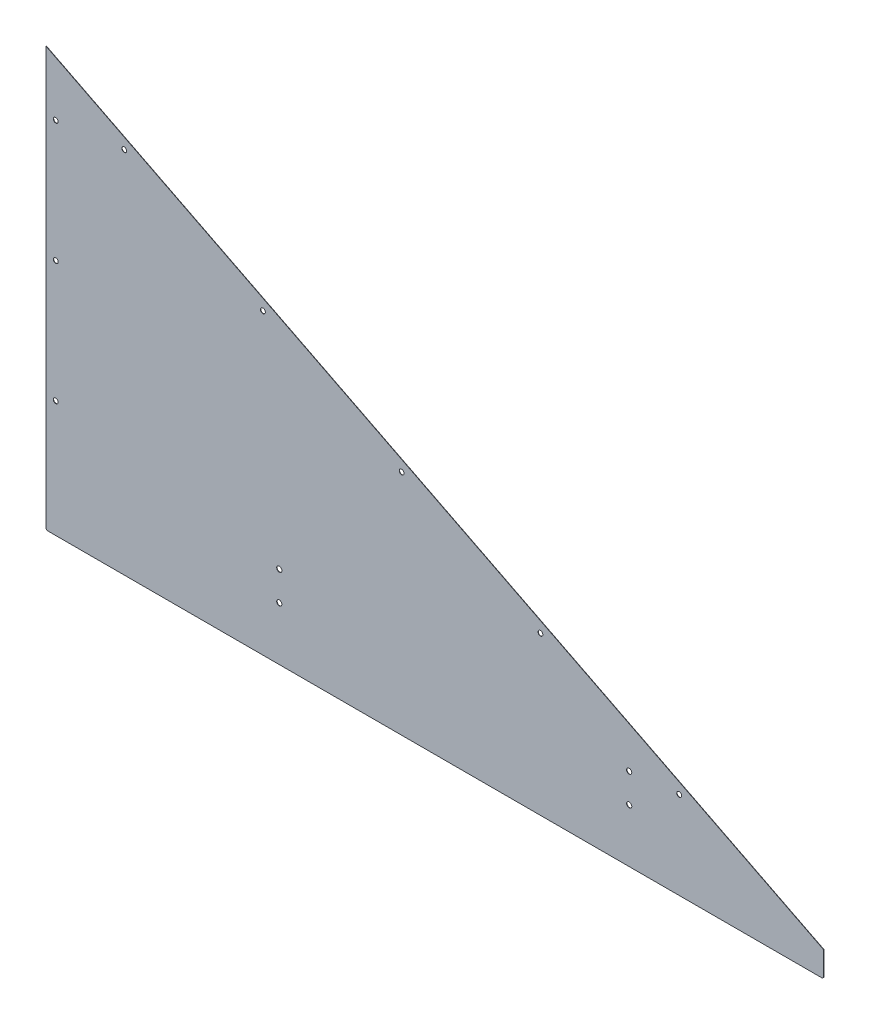
ISO-10303-21;
HEADER;
FILE_DESCRIPTION(('STEP AP214'),'2;1');
FILE_NAME('part.step','',(''),(''),'','','');
FILE_SCHEMA(('AUTOMOTIVE_DESIGN { 1 0 10303 214 1 1 1 1 }'));
ENDSEC;
DATA;
#1=APPLICATION_CONTEXT('core data for automotive mechanical design processes');
#2=APPLICATION_PROTOCOL_DEFINITION('international standard','automotive_design',2000,#1);
#3=PRODUCT_CONTEXT('',#1,'mechanical');
#4=PRODUCT('Part','Part','',(#3));
#5=PRODUCT_RELATED_PRODUCT_CATEGORY('part','',(#4));
#6=PRODUCT_DEFINITION_FORMATION('','',#4);
#7=PRODUCT_DEFINITION_CONTEXT('part definition',#1,'design');
#8=PRODUCT_DEFINITION('design','',#6,#7);
#9=PRODUCT_DEFINITION_SHAPE('','',#8);
#10=(LENGTH_UNIT() NAMED_UNIT(*) SI_UNIT(.MILLI.,.METRE.));
#11=(NAMED_UNIT(*) PLANE_ANGLE_UNIT() SI_UNIT($,.RADIAN.));
#12=(NAMED_UNIT(*) SI_UNIT($,.STERADIAN.) SOLID_ANGLE_UNIT());
#13=UNCERTAINTY_MEASURE_WITH_UNIT(LENGTH_MEASURE(1.E-05),#10,'distance_accuracy_value','');
#14=(GEOMETRIC_REPRESENTATION_CONTEXT(3) GLOBAL_UNCERTAINTY_ASSIGNED_CONTEXT((#13)) GLOBAL_UNIT_ASSIGNED_CONTEXT((#10,
#11,#12)) REPRESENTATION_CONTEXT('',''));
#15=CARTESIAN_POINT('',(0.,0.,0.));
#16=DIRECTION('',(0.,0.,1.));
#17=DIRECTION('',(1.,0.,0.));
#18=AXIS2_PLACEMENT_3D('',#15,#16,#17);
#19=CARTESIAN_POINT('',(-572.727030658364,255.302955948216,-54.7413659443409));
#20=DIRECTION('',(1.,0.,0.));
#21=DIRECTION('',(0.,0.,-1.));
#22=AXIS2_PLACEMENT_3D('',#19,#20,#21);
#23=PLANE('',#22);
#24=DIRECTION('',(0.,-1.,0.));
#25=VECTOR('',#24,1.);
#26=CARTESIAN_POINT('',(-572.727030658364,251.170139692126,-57.4083659443409));
#27=LINE('',#26,#25);
#28=CARTESIAN_POINT('',(-572.727030658364,237.509573097656,-57.4083659443409));
#29=VERTEX_POINT('',#28);
#30=CARTESIAN_POINT('',(-572.727030658364,-307.307044051784,-57.4083659443409));
#31=VERTEX_POINT('',#30);
#32=EDGE_CURVE('E113',#29,#31,#27,.T.);
#33=ORIENTED_EDGE('',*,*,#32,.F.);
#34=DIRECTION('',(0.,0.,-1.));
#35=VECTOR('',#34,1.);
#36=CARTESIAN_POINT('',(-572.727030658364,237.509573097656,-57.4083659443409));
#37=LINE('',#36,#35);
#38=CARTESIAN_POINT('',(-572.727030658364,237.509573097656,-57.9163659443409));
#39=VERTEX_POINT('',#38);
#40=EDGE_CURVE('E53',#29,#39,#37,.T.);
#41=ORIENTED_EDGE('',*,*,#40,.T.);
#42=DIRECTION('',(0.,-1.,0.));
#43=VECTOR('',#42,1.);
#44=CARTESIAN_POINT('',(-572.727030658364,255.302955948216,-57.9163659443409));
#45=LINE('',#44,#43);
#46=CARTESIAN_POINT('',(-572.727030658364,-307.307044051784,-57.9163659443409));
#47=VERTEX_POINT('',#46);
#48=EDGE_CURVE('E59',#39,#47,#45,.T.);
#49=ORIENTED_EDGE('',*,*,#48,.T.);
#50=DIRECTION('',(0.,0.,-1.));
#51=VECTOR('',#50,1.);
#52=CARTESIAN_POINT('',(-572.727030658364,-307.307044051784,-54.7413659443409));
#53=LINE('',#52,#51);
#54=EDGE_CURVE('E11',#47,#31,#53,.F.);
#55=ORIENTED_EDGE('',*,*,#54,.T.);
#56=EDGE_LOOP('',(#33,#41,#49,#55));
#57=FACE_BOUND('',#56,.T.);
#58=ADVANCED_FACE('F36',(#57),#23,.F.);
#59=CARTESIAN_POINT('',(-572.727030658364,-309.847044051784,-54.7413659443409));
#60=DIRECTION('',(0.,1.,0.));
#61=DIRECTION('',(0.,0.,1.));
#62=AXIS2_PLACEMENT_3D('',#59,#60,#61);
#63=PLANE('',#62);
#64=DIRECTION('',(1.,0.,0.));
#65=VECTOR('',#64,1.);
#66=CARTESIAN_POINT('',(-570.187030658364,-309.847044051784,-57.4083659443409));
#67=LINE('',#66,#65);
#68=CARTESIAN_POINT('',(-570.187030658364,-309.847044051784,-57.4083659443409));
#69=VERTEX_POINT('',#68);
#70=CARTESIAN_POINT('',(440.732969341636,-309.847044051784,-57.4083659443409));
#71=VERTEX_POINT('',#70);
#72=EDGE_CURVE('E126',#69,#71,#67,.T.);
#73=ORIENTED_EDGE('',*,*,#72,.F.);
#74=DIRECTION('',(0.,0.,-1.));
#75=VECTOR('',#74,1.);
#76=CARTESIAN_POINT('',(-570.187030658364,-309.847044051784,-54.7413659443409));
#77=LINE('',#76,#75);
#78=CARTESIAN_POINT('',(-570.187030658364,-309.847044051784,-57.9163659443409));
#79=VERTEX_POINT('',#78);
#80=EDGE_CURVE('E238',#69,#79,#77,.T.);
#81=ORIENTED_EDGE('',*,*,#80,.T.);
#82=DIRECTION('',(1.,0.,0.));
#83=VECTOR('',#82,1.);
#84=CARTESIAN_POINT('',(-572.727030658364,-309.847044051784,-57.9163659443409));
#85=LINE('',#84,#83);
#86=CARTESIAN_POINT('',(440.732969341636,-309.847044051784,-57.9163659443409));
#87=VERTEX_POINT('',#86);
#88=EDGE_CURVE('E223',#79,#87,#85,.T.);
#89=ORIENTED_EDGE('',*,*,#88,.T.);
#90=DIRECTION('',(0.,0.,-1.));
#91=VECTOR('',#90,1.);
#92=CARTESIAN_POINT('',(440.732969341636,-309.847044051784,-54.7413659443409));
#93=LINE('',#92,#91);
#94=EDGE_CURVE('E46',#87,#71,#93,.F.);
#95=ORIENTED_EDGE('',*,*,#94,.T.);
#96=EDGE_LOOP('',(#73,#81,#89,#95));
#97=FACE_BOUND('',#96,.T.);
#98=ADVANCED_FACE('F247',(#97),#63,.F.);
#99=CARTESIAN_POINT('',(443.272969341636,-309.847044051784,-54.7413659443409));
#100=DIRECTION('',(-1.,0.,0.));
#101=DIRECTION('',(0.,0.,1.));
#102=AXIS2_PLACEMENT_3D('',#99,#100,#101);
#103=PLANE('',#102);
#104=DIRECTION('',(0.,1.,0.));
#105=VECTOR('',#104,1.);
#106=CARTESIAN_POINT('',(443.272969341636,-309.847044051784,-57.9163659443409));
#107=LINE('',#106,#105);
#108=CARTESIAN_POINT('',(443.272969341636,-307.307044051784,-57.9163659443409));
#109=VERTEX_POINT('',#108);
#110=CARTESIAN_POINT('',(443.272969341636,-276.840426902344,-57.9163659443409));
#111=VERTEX_POINT('',#110);
#112=EDGE_CURVE('E105',#109,#111,#107,.T.);
#113=ORIENTED_EDGE('',*,*,#112,.T.);
#114=DIRECTION('',(0.,0.,-1.));
#115=VECTOR('',#114,1.);
#116=CARTESIAN_POINT('',(443.272969341636,-276.840426902344,-57.4083659443409));
#117=LINE('',#116,#115);
#118=CARTESIAN_POINT('',(443.272969341636,-276.840426902344,-57.4083659443409));
#119=VERTEX_POINT('',#118);
#120=EDGE_CURVE('E91',#119,#111,#117,.T.);
#121=ORIENTED_EDGE('',*,*,#120,.F.);
#122=DIRECTION('',(0.,1.,0.));
#123=VECTOR('',#122,1.);
#124=CARTESIAN_POINT('',(443.272969341636,-307.307044051784,-57.4083659443409));
#125=LINE('',#124,#123);
#126=CARTESIAN_POINT('',(443.272969341636,-307.307044051784,-57.4083659443409));
#127=VERTEX_POINT('',#126);
#128=EDGE_CURVE('E102',#127,#119,#125,.T.);
#129=ORIENTED_EDGE('',*,*,#128,.F.);
#130=DIRECTION('',(0.,0.,-1.));
#131=VECTOR('',#130,1.);
#132=CARTESIAN_POINT('',(443.272969341636,-307.307044051784,-54.7413659443409));
#133=LINE('',#132,#131);
#134=EDGE_CURVE('E235',#127,#109,#133,.T.);
#135=ORIENTED_EDGE('',*,*,#134,.T.);
#136=EDGE_LOOP('',(#113,#121,#129,#135));
#137=FACE_BOUND('',#136,.T.);
#138=ADVANCED_FACE('F101',(#137),#103,.F.);
#139=CARTESIAN_POINT('',(-560.027030658364,-157.447044051784,-54.7413659443409));
#140=DIRECTION('',(0.,0.,1.));
#141=DIRECTION('',(1.,0.,0.));
#142=AXIS2_PLACEMENT_3D('',#139,#140,#141);
#143=CYLINDRICAL_SURFACE('',#142,3.17499999999993);
#144=CARTESIAN_POINT('',(-560.027030658364,-157.447044051784,-57.9163659443409));
#145=DIRECTION('',(0.,0.,1.));
#146=DIRECTION('',(1.,0.,0.));
#147=AXIS2_PLACEMENT_3D('',#144,#145,#146);
#148=CIRCLE('',#147,3.17499999999993);
#149=CARTESIAN_POINT('',(-556.852030658364,-157.447044051784,-57.9163659443409));
#150=VERTEX_POINT('',#149);
#151=EDGE_CURVE('E217',#150,#150,#148,.T.);
#152=ORIENTED_EDGE('',*,*,#151,.F.);
#153=EDGE_LOOP('',(#152));
#154=FACE_BOUND('',#153,.T.);
#155=CARTESIAN_POINT('',(-560.027030658364,-157.447044051784,-57.4083659443409));
#156=DIRECTION('',(0.,0.,1.));
#157=DIRECTION('',(1.,0.,0.));
#158=AXIS2_PLACEMENT_3D('',#155,#156,#157);
#159=CIRCLE('',#158,3.17499999999993);
#160=CARTESIAN_POINT('',(-556.852030658364,-157.447044051784,-57.4083659443409));
#161=VERTEX_POINT('',#160);
#162=EDGE_CURVE('E169',#161,#161,#159,.F.);
#163=ORIENTED_EDGE('',*,*,#162,.F.);
#164=EDGE_LOOP('',(#163));
#165=FACE_BOUND('',#164,.T.);
#166=ADVANCED_FACE('F283',(#154,#165),#143,.F.);
#167=CARTESIAN_POINT('',(-560.027030658364,1.30295594821589,-54.7413659443409));
#168=DIRECTION('',(0.,0.,1.));
#169=DIRECTION('',(1.,0.,0.));
#170=AXIS2_PLACEMENT_3D('',#167,#168,#169);
#171=CYLINDRICAL_SURFACE('',#170,3.17499999999993);
#172=CARTESIAN_POINT('',(-560.027030658364,1.30295594821589,-57.9163659443409));
#173=DIRECTION('',(0.,0.,1.));
#174=DIRECTION('',(1.,0.,0.));
#175=AXIS2_PLACEMENT_3D('',#172,#173,#174);
#176=CIRCLE('',#175,3.17499999999993);
#177=CARTESIAN_POINT('',(-556.852030658364,1.30295594821589,-57.9163659443409));
#178=VERTEX_POINT('',#177);
#179=EDGE_CURVE('E213',#178,#178,#176,.T.);
#180=ORIENTED_EDGE('',*,*,#179,.F.);
#181=EDGE_LOOP('',(#180));
#182=FACE_BOUND('',#181,.T.);
#183=CARTESIAN_POINT('',(-560.027030658364,1.30295594821589,-57.4083659443409));
#184=DIRECTION('',(0.,0.,1.));
#185=DIRECTION('',(1.,0.,0.));
#186=AXIS2_PLACEMENT_3D('',#183,#184,#185);
#187=CIRCLE('',#186,3.17499999999993);
#188=CARTESIAN_POINT('',(-556.852030658364,1.30295594821589,-57.4083659443409));
#189=VERTEX_POINT('',#188);
#190=EDGE_CURVE('E165',#189,#189,#187,.F.);
#191=ORIENTED_EDGE('',*,*,#190,.F.);
#192=EDGE_LOOP('',(#191));
#193=FACE_BOUND('',#192,.T.);
#194=ADVANCED_FACE('F290',(#182,#193),#171,.F.);
#195=CARTESIAN_POINT('',(-560.027030658364,160.052955948216,-54.7413659443409));
#196=DIRECTION('',(0.,0.,1.));
#197=DIRECTION('',(1.,0.,0.));
#198=AXIS2_PLACEMENT_3D('',#195,#196,#197);
#199=CYLINDRICAL_SURFACE('',#198,3.17499999999993);
#200=CARTESIAN_POINT('',(-560.027030658364,160.052955948216,-57.9163659443409));
#201=DIRECTION('',(0.,0.,1.));
#202=DIRECTION('',(1.,0.,0.));
#203=AXIS2_PLACEMENT_3D('',#200,#201,#202);
#204=CIRCLE('',#203,3.17499999999993);
#205=CARTESIAN_POINT('',(-556.852030658364,160.052955948216,-57.9163659443409));
#206=VERTEX_POINT('',#205);
#207=EDGE_CURVE('E209',#206,#206,#204,.T.);
#208=ORIENTED_EDGE('',*,*,#207,.F.);
#209=EDGE_LOOP('',(#208));
#210=FACE_BOUND('',#209,.T.);
#211=CARTESIAN_POINT('',(-560.027030658364,160.052955948216,-57.4083659443409));
#212=DIRECTION('',(0.,0.,1.));
#213=DIRECTION('',(1.,0.,0.));
#214=AXIS2_PLACEMENT_3D('',#211,#212,#213);
#215=CIRCLE('',#214,3.17499999999993);
#216=CARTESIAN_POINT('',(-556.852030658364,160.052955948216,-57.4083659443409));
#217=VERTEX_POINT('',#216);
#218=EDGE_CURVE('E161',#217,#217,#215,.F.);
#219=ORIENTED_EDGE('',*,*,#218,.F.);
#220=EDGE_LOOP('',(#219));
#221=FACE_BOUND('',#220,.T.);
#222=ADVANCED_FACE('F294',(#210,#221),#199,.F.);
#223=CARTESIAN_POINT('',(189.272969341636,-201.897044051912,-54.7413659443409));
#224=DIRECTION('',(0.,0.,1.));
#225=DIRECTION('',(1.,0.,0.));
#226=AXIS2_PLACEMENT_3D('',#223,#224,#225);
#227=CYLINDRICAL_SURFACE('',#226,3.373501);
#228=CARTESIAN_POINT('',(189.272969341636,-201.897044051912,-57.9163659443409));
#229=DIRECTION('',(0.,0.,1.));
#230=DIRECTION('',(1.,0.,0.));
#231=AXIS2_PLACEMENT_3D('',#228,#229,#230);
#232=CIRCLE('',#231,3.373501);
#233=CARTESIAN_POINT('',(192.646470341636,-201.897044051912,-57.9163659443409));
#234=VERTEX_POINT('',#233);
#235=EDGE_CURVE('E205',#234,#234,#232,.T.);
#236=ORIENTED_EDGE('',*,*,#235,.F.);
#237=EDGE_LOOP('',(#236));
#238=FACE_BOUND('',#237,.T.);
#239=CARTESIAN_POINT('',(189.272969341636,-201.897044051912,-57.4083659443409));
#240=DIRECTION('',(0.,0.,1.));
#241=DIRECTION('',(1.,0.,0.));
#242=AXIS2_PLACEMENT_3D('',#239,#240,#241);
#243=CIRCLE('',#242,3.373501);
#244=CARTESIAN_POINT('',(192.646470341636,-201.897044051912,-57.4083659443409));
#245=VERTEX_POINT('',#244);
#246=EDGE_CURVE('E157',#245,#245,#243,.F.);
#247=ORIENTED_EDGE('',*,*,#246,.F.);
#248=EDGE_LOOP('',(#247));
#249=FACE_BOUND('',#248,.T.);
#250=ADVANCED_FACE('F298',(#238,#249),#227,.F.);
#251=CARTESIAN_POINT('',(-267.927030658364,-239.997044051912,-54.7413659443409));
#252=DIRECTION('',(0.,0.,1.));
#253=DIRECTION('',(1.,0.,0.));
#254=AXIS2_PLACEMENT_3D('',#251,#252,#253);
#255=CYLINDRICAL_SURFACE('',#254,3.373501);
#256=CARTESIAN_POINT('',(-267.927030658364,-239.997044051912,-57.9163659443409));
#257=DIRECTION('',(0.,0.,1.));
#258=DIRECTION('',(1.,0.,0.));
#259=AXIS2_PLACEMENT_3D('',#256,#257,#258);
#260=CIRCLE('',#259,3.373501);
#261=CARTESIAN_POINT('',(-264.553529658364,-239.997044051912,-57.9163659443409));
#262=VERTEX_POINT('',#261);
#263=EDGE_CURVE('E201',#262,#262,#260,.T.);
#264=ORIENTED_EDGE('',*,*,#263,.F.);
#265=EDGE_LOOP('',(#264));
#266=FACE_BOUND('',#265,.T.);
#267=CARTESIAN_POINT('',(-267.927030658364,-239.997044051912,-57.4083659443409));
#268=DIRECTION('',(0.,0.,1.));
#269=DIRECTION('',(1.,0.,0.));
#270=AXIS2_PLACEMENT_3D('',#267,#268,#269);
#271=CIRCLE('',#270,3.373501);
#272=CARTESIAN_POINT('',(-264.553529658364,-239.997044051912,-57.4083659443409));
#273=VERTEX_POINT('',#272);
#274=EDGE_CURVE('E153',#273,#273,#271,.F.);
#275=ORIENTED_EDGE('',*,*,#274,.F.);
#276=EDGE_LOOP('',(#275));
#277=FACE_BOUND('',#276,.T.);
#278=ADVANCED_FACE('F302',(#266,#277),#255,.F.);
#279=CARTESIAN_POINT('',(-267.927030658364,-201.897044051912,-54.7413659443409));
#280=DIRECTION('',(0.,0.,1.));
#281=DIRECTION('',(1.,0.,0.));
#282=AXIS2_PLACEMENT_3D('',#279,#280,#281);
#283=CYLINDRICAL_SURFACE('',#282,3.373501);
#284=CARTESIAN_POINT('',(-267.927030658364,-201.897044051912,-57.9163659443409));
#285=DIRECTION('',(0.,0.,1.));
#286=DIRECTION('',(1.,0.,0.));
#287=AXIS2_PLACEMENT_3D('',#284,#285,#286);
#288=CIRCLE('',#287,3.373501);
#289=CARTESIAN_POINT('',(-264.553529658364,-201.897044051912,-57.9163659443409));
#290=VERTEX_POINT('',#289);
#291=EDGE_CURVE('E197',#290,#290,#288,.T.);
#292=ORIENTED_EDGE('',*,*,#291,.F.);
#293=EDGE_LOOP('',(#292));
#294=FACE_BOUND('',#293,.T.);
#295=CARTESIAN_POINT('',(-267.927030658364,-201.897044051912,-57.4083659443409));
#296=DIRECTION('',(0.,0.,1.));
#297=DIRECTION('',(1.,0.,0.));
#298=AXIS2_PLACEMENT_3D('',#295,#296,#297);
#299=CIRCLE('',#298,3.373501);
#300=CARTESIAN_POINT('',(-264.553529658364,-201.897044051912,-57.4083659443409));
#301=VERTEX_POINT('',#300);
#302=EDGE_CURVE('E149',#301,#301,#299,.F.);
#303=ORIENTED_EDGE('',*,*,#302,.F.);
#304=EDGE_LOOP('',(#303));
#305=FACE_BOUND('',#304,.T.);
#306=ADVANCED_FACE('F306',(#294,#305),#283,.F.);
#307=CARTESIAN_POINT('',(189.272969341636,-239.997044051912,-54.7413659443409));
#308=DIRECTION('',(0.,0.,1.));
#309=DIRECTION('',(1.,0.,0.));
#310=AXIS2_PLACEMENT_3D('',#307,#308,#309);
#311=CYLINDRICAL_SURFACE('',#310,3.373501);
#312=CARTESIAN_POINT('',(189.272969341636,-239.997044051912,-57.9163659443409));
#313=DIRECTION('',(0.,0.,1.));
#314=DIRECTION('',(1.,0.,0.));
#315=AXIS2_PLACEMENT_3D('',#312,#313,#314);
#316=CIRCLE('',#315,3.373501);
#317=CARTESIAN_POINT('',(192.646470341636,-239.997044051912,-57.9163659443409));
#318=VERTEX_POINT('',#317);
#319=EDGE_CURVE('E193',#318,#318,#316,.T.);
#320=ORIENTED_EDGE('',*,*,#319,.F.);
#321=EDGE_LOOP('',(#320));
#322=FACE_BOUND('',#321,.T.);
#323=CARTESIAN_POINT('',(189.272969341636,-239.997044051912,-57.4083659443409));
#324=DIRECTION('',(0.,0.,1.));
#325=DIRECTION('',(1.,0.,0.));
#326=AXIS2_PLACEMENT_3D('',#323,#324,#325);
#327=CIRCLE('',#326,3.373501);
#328=CARTESIAN_POINT('',(192.646470341636,-239.997044051912,-57.4083659443409));
#329=VERTEX_POINT('',#328);
#330=EDGE_CURVE('E145',#329,#329,#327,.F.);
#331=ORIENTED_EDGE('',*,*,#330,.F.);
#332=EDGE_LOOP('',(#331));
#333=FACE_BOUND('',#332,.T.);
#334=ADVANCED_FACE('F273',(#322,#333),#311,.F.);
#335=CARTESIAN_POINT('',(440.732969341636,-307.307044051784,-54.7413659443409));
#336=DIRECTION('',(0.,0.,-1.));
#337=DIRECTION('',(-1.,0.,0.));
#338=AXIS2_PLACEMENT_3D('',#335,#336,#337);
#339=CYLINDRICAL_SURFACE('',#338,2.54);
#340=ORIENTED_EDGE('',*,*,#134,.F.);
#341=CARTESIAN_POINT('',(440.732969341636,-307.307044051784,-57.4083659443409));
#342=DIRECTION('',(0.,0.,1.));
#343=DIRECTION('',(1.,0.,0.));
#344=AXIS2_PLACEMENT_3D('',#341,#342,#343);
#345=CIRCLE('',#344,2.53999999999999);
#346=EDGE_CURVE('E111',#71,#127,#345,.T.);
#347=ORIENTED_EDGE('',*,*,#346,.F.);
#348=ORIENTED_EDGE('',*,*,#94,.F.);
#349=CARTESIAN_POINT('',(440.732969341636,-307.307044051784,-57.9163659443409));
#350=DIRECTION('',(0.,0.,1.));
#351=DIRECTION('',(1.,0.,0.));
#352=AXIS2_PLACEMENT_3D('',#349,#350,#351);
#353=CIRCLE('',#352,2.54);
#354=EDGE_CURVE('E232',#109,#87,#353,.F.);
#355=ORIENTED_EDGE('',*,*,#354,.F.);
#356=EDGE_LOOP('',(#340,#347,#348,#355));
#357=FACE_BOUND('',#356,.T.);
#358=ADVANCED_FACE('F252',(#357),#339,.T.);
#359=CARTESIAN_POINT('',(-570.187030658364,-307.307044051784,-54.7413659443409));
#360=DIRECTION('',(0.,0.,-1.));
#361=DIRECTION('',(-1.,0.,0.));
#362=AXIS2_PLACEMENT_3D('',#359,#360,#361);
#363=CYLINDRICAL_SURFACE('',#362,2.54);
#364=ORIENTED_EDGE('',*,*,#80,.F.);
#365=CARTESIAN_POINT('',(-570.187030658364,-307.307044051784,-57.4083659443409));
#366=DIRECTION('',(0.,0.,1.));
#367=DIRECTION('',(1.,0.,0.));
#368=AXIS2_PLACEMENT_3D('',#365,#366,#367);
#369=CIRCLE('',#368,2.53999999999999);
#370=EDGE_CURVE('E118',#31,#69,#369,.T.);
#371=ORIENTED_EDGE('',*,*,#370,.F.);
#372=ORIENTED_EDGE('',*,*,#54,.F.);
#373=CARTESIAN_POINT('',(-570.187030658364,-307.307044051784,-57.9163659443409));
#374=DIRECTION('',(0.,0.,1.));
#375=DIRECTION('',(1.,0.,0.));
#376=AXIS2_PLACEMENT_3D('',#373,#374,#375);
#377=CIRCLE('',#376,2.54);
#378=EDGE_CURVE('E229',#79,#47,#377,.F.);
#379=ORIENTED_EDGE('',*,*,#378,.F.);
#380=EDGE_LOOP('',(#364,#371,#372,#379));
#381=FACE_BOUND('',#380,.T.);
#382=ADVANCED_FACE('F38',(#381),#363,.T.);
#383=CARTESIAN_POINT('',(-108.008719548157,-11.9887781823342,-54.7413659443409));
#384=DIRECTION('',(0.,0.,1.));
#385=DIRECTION('',(1.,0.,0.));
#386=AXIS2_PLACEMENT_3D('',#383,#384,#385);
#387=CYLINDRICAL_SURFACE('',#386,3.17500000000004);
#388=CARTESIAN_POINT('',(-108.008719548157,-11.9887781823342,-57.9163659443409));
#389=DIRECTION('',(0.,0.,1.));
#390=DIRECTION('',(1.,0.,0.));
#391=AXIS2_PLACEMENT_3D('',#388,#389,#390);
#392=CIRCLE('',#391,3.17500000000004);
#393=CARTESIAN_POINT('',(-104.833719548157,-11.9887781823342,-57.9163659443409));
#394=VERTEX_POINT('',#393);
#395=EDGE_CURVE('E189',#394,#394,#392,.T.);
#396=ORIENTED_EDGE('',*,*,#395,.F.);
#397=EDGE_LOOP('',(#396));
#398=FACE_BOUND('',#397,.T.);
#399=CARTESIAN_POINT('',(-108.008719548157,-11.9887781823342,-57.4083659443409));
#400=DIRECTION('',(0.,0.,1.));
#401=DIRECTION('',(1.,0.,0.));
#402=AXIS2_PLACEMENT_3D('',#399,#400,#401);
#403=CIRCLE('',#402,3.17500000000004);
#404=CARTESIAN_POINT('',(-104.833719548157,-11.9887781823342,-57.4083659443409));
#405=VERTEX_POINT('',#404);
#406=EDGE_CURVE('E141',#405,#405,#403,.F.);
#407=ORIENTED_EDGE('',*,*,#406,.F.);
#408=EDGE_LOOP('',(#407));
#409=FACE_BOUND('',#408,.T.);
#410=ADVANCED_FACE('F265',(#398,#409),#387,.F.);
#411=CARTESIAN_POINT('',(73.2833948908056,-103.767911117059,-54.7413659443409));
#412=DIRECTION('',(0.,0.,1.));
#413=DIRECTION('',(1.,0.,0.));
#414=AXIS2_PLACEMENT_3D('',#411,#412,#413);
#415=CYLINDRICAL_SURFACE('',#414,3.17499999999998);
#416=CARTESIAN_POINT('',(73.2833948908056,-103.767911117059,-57.9163659443409));
#417=DIRECTION('',(0.,0.,1.));
#418=DIRECTION('',(1.,0.,0.));
#419=AXIS2_PLACEMENT_3D('',#416,#417,#418);
#420=CIRCLE('',#419,3.17499999999998);
#421=CARTESIAN_POINT('',(76.4583948908056,-103.767911117059,-57.9163659443409));
#422=VERTEX_POINT('',#421);
#423=EDGE_CURVE('E185',#422,#422,#420,.T.);
#424=ORIENTED_EDGE('',*,*,#423,.F.);
#425=EDGE_LOOP('',(#424));
#426=FACE_BOUND('',#425,.T.);
#427=CARTESIAN_POINT('',(73.2833948908056,-103.767911117059,-57.4083659443409));
#428=DIRECTION('',(0.,0.,1.));
#429=DIRECTION('',(1.,0.,0.));
#430=AXIS2_PLACEMENT_3D('',#427,#428,#429);
#431=CIRCLE('',#430,3.17499999999998);
#432=CARTESIAN_POINT('',(76.4583948908056,-103.767911117059,-57.4083659443409));
#433=VERTEX_POINT('',#432);
#434=EDGE_CURVE('E137',#433,#433,#431,.F.);
#435=ORIENTED_EDGE('',*,*,#434,.F.);
#436=EDGE_LOOP('',(#435));
#437=FACE_BOUND('',#436,.T.);
#438=ADVANCED_FACE('F270',(#426,#437),#415,.F.);
#439=CARTESIAN_POINT('',(254.575509329769,-195.547044051784,-54.7413659443409));
#440=DIRECTION('',(0.,0.,1.));
#441=DIRECTION('',(1.,0.,0.));
#442=AXIS2_PLACEMENT_3D('',#439,#440,#441);
#443=CYLINDRICAL_SURFACE('',#442,3.175);
#444=CARTESIAN_POINT('',(254.575509329769,-195.547044051784,-57.9163659443409));
#445=DIRECTION('',(0.,0.,1.));
#446=DIRECTION('',(1.,0.,0.));
#447=AXIS2_PLACEMENT_3D('',#444,#445,#446);
#448=CIRCLE('',#447,3.175);
#449=CARTESIAN_POINT('',(257.750509329769,-195.547044051784,-57.9163659443409));
#450=VERTEX_POINT('',#449);
#451=EDGE_CURVE('E181',#450,#450,#448,.T.);
#452=ORIENTED_EDGE('',*,*,#451,.F.);
#453=EDGE_LOOP('',(#452));
#454=FACE_BOUND('',#453,.T.);
#455=CARTESIAN_POINT('',(254.575509329769,-195.547044051784,-57.4083659443409));
#456=DIRECTION('',(0.,0.,1.));
#457=DIRECTION('',(1.,0.,0.));
#458=AXIS2_PLACEMENT_3D('',#455,#456,#457);
#459=CIRCLE('',#458,3.175);
#460=CARTESIAN_POINT('',(257.750509329769,-195.547044051784,-57.4083659443409));
#461=VERTEX_POINT('',#460);
#462=EDGE_CURVE('E133',#461,#461,#459,.F.);
#463=ORIENTED_EDGE('',*,*,#462,.F.);
#464=EDGE_LOOP('',(#463));
#465=FACE_BOUND('',#464,.T.);
#466=ADVANCED_FACE('F316',(#454,#465),#443,.F.);
#467=CARTESIAN_POINT('',(-289.30083398712,79.7903547523909,-54.7413659443409));
#468=DIRECTION('',(0.,0.,1.));
#469=DIRECTION('',(1.,0.,0.));
#470=AXIS2_PLACEMENT_3D('',#467,#468,#469);
#471=CYLINDRICAL_SURFACE('',#470,3.17500000000004);
#472=CARTESIAN_POINT('',(-289.30083398712,79.7903547523909,-57.9163659443409));
#473=DIRECTION('',(0.,0.,1.));
#474=DIRECTION('',(1.,0.,0.));
#475=AXIS2_PLACEMENT_3D('',#472,#473,#474);
#476=CIRCLE('',#475,3.17500000000004);
#477=CARTESIAN_POINT('',(-286.12583398712,79.7903547523909,-57.9163659443409));
#478=VERTEX_POINT('',#477);
#479=EDGE_CURVE('E177',#478,#478,#476,.T.);
#480=ORIENTED_EDGE('',*,*,#479,.F.);
#481=EDGE_LOOP('',(#480));
#482=FACE_BOUND('',#481,.T.);
#483=CARTESIAN_POINT('',(-289.30083398712,79.7903547523909,-57.4083659443409));
#484=DIRECTION('',(0.,0.,1.));
#485=DIRECTION('',(1.,0.,0.));
#486=AXIS2_PLACEMENT_3D('',#483,#484,#485);
#487=CIRCLE('',#486,3.17500000000004);
#488=CARTESIAN_POINT('',(-286.12583398712,79.7903547523909,-57.4083659443409));
#489=VERTEX_POINT('',#488);
#490=EDGE_CURVE('E129',#489,#489,#487,.F.);
#491=ORIENTED_EDGE('',*,*,#490,.F.);
#492=EDGE_LOOP('',(#491));
#493=FACE_BOUND('',#492,.T.);
#494=ADVANCED_FACE('F320',(#482,#493),#471,.F.);
#495=CARTESIAN_POINT('',(-470.592948426084,171.569487687116,-54.7413659443409));
#496=DIRECTION('',(0.,0.,1.));
#497=DIRECTION('',(1.,0.,0.));
#498=AXIS2_PLACEMENT_3D('',#495,#496,#497);
#499=CYLINDRICAL_SURFACE('',#498,3.17500000000004);
#500=CARTESIAN_POINT('',(-470.592948426084,171.569487687116,-57.9163659443409));
#501=DIRECTION('',(0.,0.,1.));
#502=DIRECTION('',(1.,0.,0.));
#503=AXIS2_PLACEMENT_3D('',#500,#501,#502);
#504=CIRCLE('',#503,3.17500000000004);
#505=CARTESIAN_POINT('',(-467.417948426084,171.569487687116,-57.9163659443409));
#506=VERTEX_POINT('',#505);
#507=EDGE_CURVE('E173',#506,#506,#504,.T.);
#508=ORIENTED_EDGE('',*,*,#507,.F.);
#509=EDGE_LOOP('',(#508));
#510=FACE_BOUND('',#509,.T.);
#511=CARTESIAN_POINT('',(-470.592948426084,171.569487687116,-57.4083659443409));
#512=DIRECTION('',(0.,0.,1.));
#513=DIRECTION('',(1.,0.,0.));
#514=AXIS2_PLACEMENT_3D('',#511,#512,#513);
#515=CIRCLE('',#514,3.17500000000004);
#516=CARTESIAN_POINT('',(-467.417948426084,171.569487687116,-57.4083659443409));
#517=VERTEX_POINT('',#516);
#518=EDGE_CURVE('E40',#517,#517,#515,.F.);
#519=ORIENTED_EDGE('',*,*,#518,.F.);
#520=EDGE_LOOP('',(#519));
#521=FACE_BOUND('',#520,.T.);
#522=ADVANCED_FACE('F286',(#510,#521),#499,.F.);
#523=CARTESIAN_POINT('',(443.272969341636,-259.047044051784,-57.9163659443409));
#524=DIRECTION('',(0.,0.,1.));
#525=DIRECTION('',(1.,0.,0.));
#526=AXIS2_PLACEMENT_3D('',#523,#524,#525);
#527=PLANE('',#526);
#528=ORIENTED_EDGE('',*,*,#507,.T.);
#529=EDGE_LOOP('',(#528));
#530=FACE_BOUND('',#529,.T.);
#531=ORIENTED_EDGE('',*,*,#479,.T.);
#532=EDGE_LOOP('',(#531));
#533=FACE_BOUND('',#532,.T.);
#534=ORIENTED_EDGE('',*,*,#451,.T.);
#535=EDGE_LOOP('',(#534));
#536=FACE_BOUND('',#535,.T.);
#537=ORIENTED_EDGE('',*,*,#423,.T.);
#538=EDGE_LOOP('',(#537));
#539=FACE_BOUND('',#538,.T.);
#540=ORIENTED_EDGE('',*,*,#395,.T.);
#541=EDGE_LOOP('',(#540));
#542=FACE_BOUND('',#541,.T.);
#543=ORIENTED_EDGE('',*,*,#319,.T.);
#544=EDGE_LOOP('',(#543));
#545=FACE_BOUND('',#544,.T.);
#546=ORIENTED_EDGE('',*,*,#291,.T.);
#547=EDGE_LOOP('',(#546));
#548=FACE_BOUND('',#547,.T.);
#549=ORIENTED_EDGE('',*,*,#263,.T.);
#550=EDGE_LOOP('',(#549));
#551=FACE_BOUND('',#550,.T.);
#552=ORIENTED_EDGE('',*,*,#235,.T.);
#553=EDGE_LOOP('',(#552));
#554=FACE_BOUND('',#553,.T.);
#555=ORIENTED_EDGE('',*,*,#207,.T.);
#556=EDGE_LOOP('',(#555));
#557=FACE_BOUND('',#556,.T.);
#558=ORIENTED_EDGE('',*,*,#179,.T.);
#559=EDGE_LOOP('',(#558));
#560=FACE_BOUND('',#559,.T.);
#561=ORIENTED_EDGE('',*,*,#151,.T.);
#562=EDGE_LOOP('',(#561));
#563=FACE_BOUND('',#562,.T.);
#564=ORIENTED_EDGE('',*,*,#48,.F.);
#565=DIRECTION('',(0.892185602553952,-0.451668961292938,0.));
#566=VECTOR('',#565,1.);
#567=CARTESIAN_POINT('',(436.102724581111,-273.210490492328,-57.9163659443409));
#568=LINE('',#567,#566);
#569=EDGE_CURVE('E120',#39,#111,#568,.T.);
#570=ORIENTED_EDGE('',*,*,#569,.T.);
#571=ORIENTED_EDGE('',*,*,#112,.F.);
#572=ORIENTED_EDGE('',*,*,#354,.T.);
#573=ORIENTED_EDGE('',*,*,#88,.F.);
#574=ORIENTED_EDGE('',*,*,#378,.T.);
#575=EDGE_LOOP('',(#564,#570,#571,#572,#573,#574));
#576=FACE_BOUND('',#575,.T.);
#577=ADVANCED_FACE('F254',(#530,#533,#536,#539,#542,#545,#548,#551,#554,#557,#560,#563,#576),
#527,.F.);
#578=CARTESIAN_POINT('',(440.732969341636,-307.307044051784,-57.4083659443409));
#579=DIRECTION('',(0.,0.,1.));
#580=DIRECTION('',(1.,0.,0.));
#581=AXIS2_PLACEMENT_3D('',#578,#579,#580);
#582=PLANE('',#581);
#583=DIRECTION('',(-0.892185602553952,0.451668961292938,0.));
#584=VECTOR('',#583,1.);
#585=CARTESIAN_POINT('',(-21.1292553342217,-41.7368006601911,-57.4083659443409));
#586=LINE('',#585,#584);
#587=EDGE_CURVE('E88',#119,#29,#586,.T.);
#588=ORIENTED_EDGE('',*,*,#587,.T.);
#589=ORIENTED_EDGE('',*,*,#32,.T.);
#590=ORIENTED_EDGE('',*,*,#370,.T.);
#591=ORIENTED_EDGE('',*,*,#72,.T.);
#592=ORIENTED_EDGE('',*,*,#346,.T.);
#593=ORIENTED_EDGE('',*,*,#128,.T.);
#594=EDGE_LOOP('',(#588,#589,#590,#591,#592,#593));
#595=FACE_BOUND('',#594,.T.);
#596=ORIENTED_EDGE('',*,*,#518,.T.);
#597=EDGE_LOOP('',(#596));
#598=FACE_BOUND('',#597,.T.);
#599=ORIENTED_EDGE('',*,*,#490,.T.);
#600=EDGE_LOOP('',(#599));
#601=FACE_BOUND('',#600,.T.);
#602=ORIENTED_EDGE('',*,*,#462,.T.);
#603=EDGE_LOOP('',(#602));
#604=FACE_BOUND('',#603,.T.);
#605=ORIENTED_EDGE('',*,*,#434,.T.);
#606=EDGE_LOOP('',(#605));
#607=FACE_BOUND('',#606,.T.);
#608=ORIENTED_EDGE('',*,*,#406,.T.);
#609=EDGE_LOOP('',(#608));
#610=FACE_BOUND('',#609,.T.);
#611=ORIENTED_EDGE('',*,*,#330,.T.);
#612=EDGE_LOOP('',(#611));
#613=FACE_BOUND('',#612,.T.);
#614=ORIENTED_EDGE('',*,*,#302,.T.);
#615=EDGE_LOOP('',(#614));
#616=FACE_BOUND('',#615,.T.);
#617=ORIENTED_EDGE('',*,*,#274,.T.);
#618=EDGE_LOOP('',(#617));
#619=FACE_BOUND('',#618,.T.);
#620=ORIENTED_EDGE('',*,*,#246,.T.);
#621=EDGE_LOOP('',(#620));
#622=FACE_BOUND('',#621,.T.);
#623=ORIENTED_EDGE('',*,*,#218,.T.);
#624=EDGE_LOOP('',(#623));
#625=FACE_BOUND('',#624,.T.);
#626=ORIENTED_EDGE('',*,*,#190,.T.);
#627=EDGE_LOOP('',(#626));
#628=FACE_BOUND('',#627,.T.);
#629=ORIENTED_EDGE('',*,*,#162,.T.);
#630=EDGE_LOOP('',(#629));
#631=FACE_BOUND('',#630,.T.);
#632=ADVANCED_FACE('F108',(#595,#598,#601,#604,#607,#610,#613,#616,#619,#622,#625,#628,#631),
#582,.T.);
#633=CARTESIAN_POINT('',(-21.1292553342217,-41.7368006601911,-57.4083659443409));
#634=DIRECTION('',(-0.451668961292938,-0.892185602553952,0.));
#635=DIRECTION('',(0.892185602553952,-0.451668961292938,0.));
#636=AXIS2_PLACEMENT_3D('',#633,#634,#635);
#637=PLANE('',#636);
#638=ORIENTED_EDGE('',*,*,#40,.F.);
#639=ORIENTED_EDGE('',*,*,#587,.F.);
#640=ORIENTED_EDGE('',*,*,#120,.T.);
#641=ORIENTED_EDGE('',*,*,#569,.F.);
#642=EDGE_LOOP('',(#638,#639,#640,#641));
#643=FACE_BOUND('',#642,.T.);
#644=ADVANCED_FACE('F90',(#643),#637,.F.);
#645=CLOSED_SHELL('',(#58,#98,#138,#166,#194,#222,#250,#278,#306,#334,#358,#382,#410,#438,#466,
#494,#522,#577,#632,#644));
#646=MANIFOLD_SOLID_BREP('B2',#645);
#647=ADVANCED_BREP_SHAPE_REPRESENTATION('',(#18,#646),#14);
#648=SHAPE_DEFINITION_REPRESENTATION(#9,#647);
ENDSEC;
END-ISO-10303-21;
